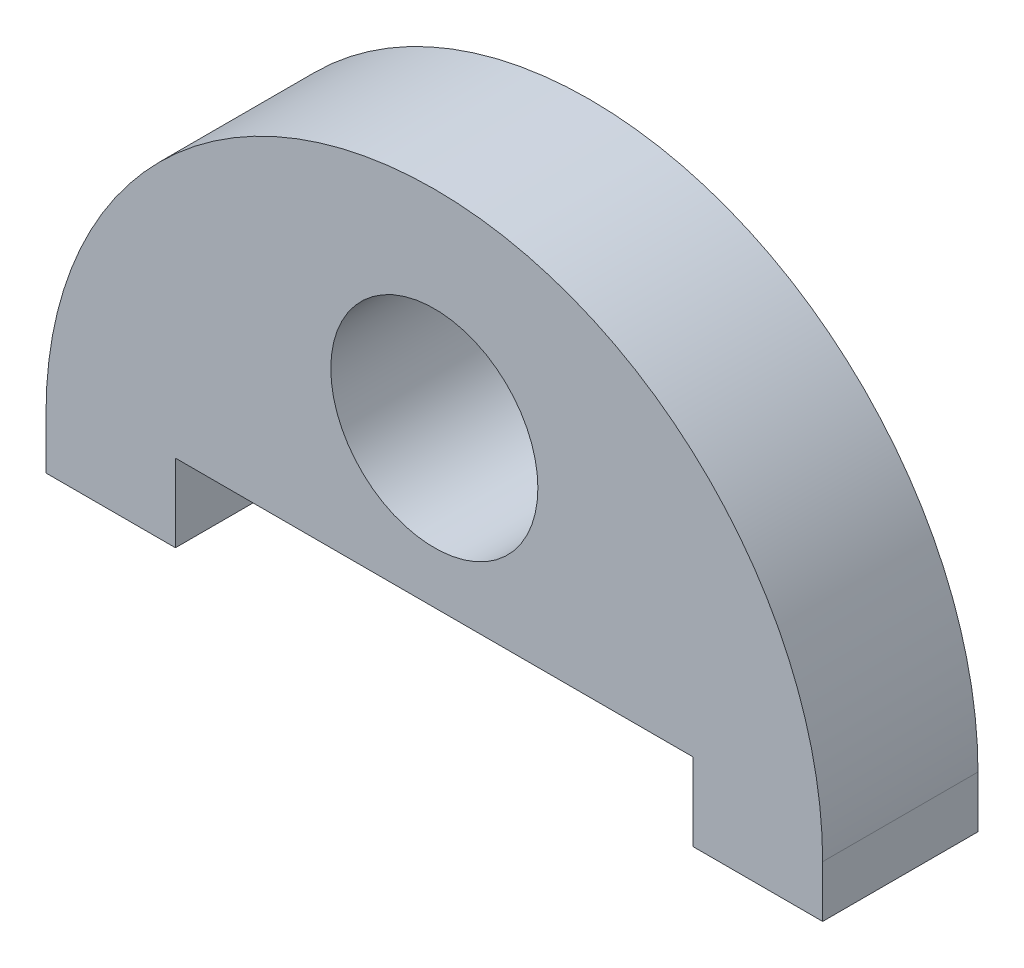
ISO-10303-21;
HEADER;
FILE_DESCRIPTION(('STEP AP214'),'2;1');
FILE_NAME('part.step','',(''),(''),'','','');
FILE_SCHEMA(('AUTOMOTIVE_DESIGN { 1 0 10303 214 1 1 1 1 }'));
ENDSEC;
DATA;
#1=APPLICATION_CONTEXT('core data for automotive mechanical design processes');
#2=APPLICATION_PROTOCOL_DEFINITION('international standard','automotive_design',2000,#1);
#3=PRODUCT_CONTEXT('',#1,'mechanical');
#4=PRODUCT('Part','Part','',(#3));
#5=PRODUCT_RELATED_PRODUCT_CATEGORY('part','',(#4));
#6=PRODUCT_DEFINITION_FORMATION('','',#4);
#7=PRODUCT_DEFINITION_CONTEXT('part definition',#1,'design');
#8=PRODUCT_DEFINITION('design','',#6,#7);
#9=PRODUCT_DEFINITION_SHAPE('','',#8);
#10=(LENGTH_UNIT() NAMED_UNIT(*) SI_UNIT(.MILLI.,.METRE.));
#11=(NAMED_UNIT(*) PLANE_ANGLE_UNIT() SI_UNIT($,.RADIAN.));
#12=(NAMED_UNIT(*) SI_UNIT($,.STERADIAN.) SOLID_ANGLE_UNIT());
#13=UNCERTAINTY_MEASURE_WITH_UNIT(LENGTH_MEASURE(1.E-05),#10,'distance_accuracy_value','');
#14=(GEOMETRIC_REPRESENTATION_CONTEXT(3) GLOBAL_UNCERTAINTY_ASSIGNED_CONTEXT((#13)) GLOBAL_UNIT_ASSIGNED_CONTEXT((#10,
#11,#12)) REPRESENTATION_CONTEXT('',''));
#15=CARTESIAN_POINT('',(0.,0.,0.));
#16=DIRECTION('',(0.,0.,1.));
#17=DIRECTION('',(1.,0.,0.));
#18=AXIS2_PLACEMENT_3D('',#15,#16,#17);
#19=CARTESIAN_POINT('',(15.,2.,6.));
#20=DIRECTION('',(0.,0.,-1.));
#21=DIRECTION('',(-1.,0.,0.));
#22=AXIS2_PLACEMENT_3D('',#19,#20,#21);
#23=PLANE('',#22);
#24=DIRECTION('',(0.,-1.,0.));
#25=VECTOR('',#24,1.);
#26=CARTESIAN_POINT('',(0.,0.,6.));
#27=LINE('',#26,#25);
#28=CARTESIAN_POINT('',(0.,2.,6.));
#29=VERTEX_POINT('',#28);
#30=CARTESIAN_POINT('',(0.,0.,6.));
#31=VERTEX_POINT('',#30);
#32=EDGE_CURVE('E146',#29,#31,#27,.T.);
#33=ORIENTED_EDGE('',*,*,#32,.T.);
#34=DIRECTION('',(1.,0.,0.));
#35=VECTOR('',#34,1.);
#36=CARTESIAN_POINT('',(0.,0.,6.));
#37=LINE('',#36,#35);
#38=CARTESIAN_POINT('',(5.,0.,6.));
#39=VERTEX_POINT('',#38);
#40=EDGE_CURVE('E94',#31,#39,#37,.T.);
#41=ORIENTED_EDGE('',*,*,#40,.T.);
#42=DIRECTION('',(0.,1.,0.));
#43=VECTOR('',#42,1.);
#44=CARTESIAN_POINT('',(5.,0.,6.));
#45=LINE('',#44,#43);
#46=CARTESIAN_POINT('',(5.,3.,6.));
#47=VERTEX_POINT('',#46);
#48=EDGE_CURVE('E161',#39,#47,#45,.T.);
#49=ORIENTED_EDGE('',*,*,#48,.T.);
#50=DIRECTION('',(1.,0.,0.));
#51=VECTOR('',#50,1.);
#52=CARTESIAN_POINT('',(5.,3.,6.));
#53=LINE('',#52,#51);
#54=CARTESIAN_POINT('',(25.,3.,6.));
#55=VERTEX_POINT('',#54);
#56=EDGE_CURVE('E174',#47,#55,#53,.T.);
#57=ORIENTED_EDGE('',*,*,#56,.T.);
#58=DIRECTION('',(0.,-1.,0.));
#59=VECTOR('',#58,1.);
#60=CARTESIAN_POINT('',(25.,3.,6.));
#61=LINE('',#60,#59);
#62=CARTESIAN_POINT('',(25.,0.,6.));
#63=VERTEX_POINT('',#62);
#64=EDGE_CURVE('E113',#55,#63,#61,.T.);
#65=ORIENTED_EDGE('',*,*,#64,.T.);
#66=DIRECTION('',(1.,0.,0.));
#67=VECTOR('',#66,1.);
#68=CARTESIAN_POINT('',(25.,0.,6.));
#69=LINE('',#68,#67);
#70=CARTESIAN_POINT('',(30.,0.,6.));
#71=VERTEX_POINT('',#70);
#72=EDGE_CURVE('E107',#63,#71,#69,.T.);
#73=ORIENTED_EDGE('',*,*,#72,.T.);
#74=DIRECTION('',(0.,1.,0.));
#75=VECTOR('',#74,1.);
#76=CARTESIAN_POINT('',(30.,0.,6.));
#77=LINE('',#76,#75);
#78=CARTESIAN_POINT('',(30.,2.,6.));
#79=VERTEX_POINT('',#78);
#80=EDGE_CURVE('E111',#71,#79,#77,.T.);
#81=ORIENTED_EDGE('',*,*,#80,.T.);
#82=CARTESIAN_POINT('',(15.,2.,6.));
#83=DIRECTION('',(0.,0.,1.));
#84=DIRECTION('',(-1.,0.,0.));
#85=AXIS2_PLACEMENT_3D('',#82,#83,#84);
#86=CIRCLE('',#85,15.);
#87=EDGE_CURVE('E51',#79,#29,#86,.T.);
#88=ORIENTED_EDGE('',*,*,#87,.T.);
#89=EDGE_LOOP('',(#33,#41,#49,#57,#65,#73,#81,#88));
#90=FACE_BOUND('',#89,.T.);
#91=CARTESIAN_POINT('',(15.,9.,6.));
#92=DIRECTION('',(0.,0.,1.));
#93=DIRECTION('',(1.,0.,0.));
#94=AXIS2_PLACEMENT_3D('',#91,#92,#93);
#95=CIRCLE('',#94,4.);
#96=CARTESIAN_POINT('',(19.,9.,6.));
#97=VERTEX_POINT('',#96);
#98=EDGE_CURVE('E135',#97,#97,#95,.T.);
#99=ORIENTED_EDGE('',*,*,#98,.F.);
#100=EDGE_LOOP('',(#99));
#101=FACE_BOUND('',#100,.T.);
#102=ADVANCED_FACE('F34',(#90,#101),#23,.F.);
#103=CARTESIAN_POINT('',(15.,2.,0.));
#104=DIRECTION('',(0.,0.,-1.));
#105=DIRECTION('',(-1.,0.,0.));
#106=AXIS2_PLACEMENT_3D('',#103,#104,#105);
#107=PLANE('',#106);
#108=DIRECTION('',(0.,-1.,0.));
#109=VECTOR('',#108,1.);
#110=CARTESIAN_POINT('',(0.,0.,0.));
#111=LINE('',#110,#109);
#112=CARTESIAN_POINT('',(0.,2.,0.));
#113=VERTEX_POINT('',#112);
#114=CARTESIAN_POINT('',(0.,0.,0.));
#115=VERTEX_POINT('',#114);
#116=EDGE_CURVE('E131',#113,#115,#111,.T.);
#117=ORIENTED_EDGE('',*,*,#116,.F.);
#118=CARTESIAN_POINT('',(15.,2.,0.));
#119=DIRECTION('',(0.,0.,1.));
#120=DIRECTION('',(-1.,0.,0.));
#121=AXIS2_PLACEMENT_3D('',#118,#119,#120);
#122=CIRCLE('',#121,15.);
#123=CARTESIAN_POINT('',(30.,2.,0.));
#124=VERTEX_POINT('',#123);
#125=EDGE_CURVE('E86',#124,#113,#122,.T.);
#126=ORIENTED_EDGE('',*,*,#125,.F.);
#127=DIRECTION('',(0.,1.,0.));
#128=VECTOR('',#127,1.);
#129=CARTESIAN_POINT('',(30.,0.,0.));
#130=LINE('',#129,#128);
#131=CARTESIAN_POINT('',(30.,0.,0.));
#132=VERTEX_POINT('',#131);
#133=EDGE_CURVE('E80',#132,#124,#130,.T.);
#134=ORIENTED_EDGE('',*,*,#133,.F.);
#135=DIRECTION('',(1.,0.,0.));
#136=VECTOR('',#135,1.);
#137=CARTESIAN_POINT('',(25.,0.,0.));
#138=LINE('',#137,#136);
#139=CARTESIAN_POINT('',(25.,0.,0.));
#140=VERTEX_POINT('',#139);
#141=EDGE_CURVE('E121',#140,#132,#138,.T.);
#142=ORIENTED_EDGE('',*,*,#141,.F.);
#143=DIRECTION('',(0.,-1.,0.));
#144=VECTOR('',#143,1.);
#145=CARTESIAN_POINT('',(25.,3.,0.));
#146=LINE('',#145,#144);
#147=CARTESIAN_POINT('',(25.,3.,0.));
#148=VERTEX_POINT('',#147);
#149=EDGE_CURVE('E141',#148,#140,#146,.T.);
#150=ORIENTED_EDGE('',*,*,#149,.F.);
#151=DIRECTION('',(1.,0.,0.));
#152=VECTOR('',#151,1.);
#153=CARTESIAN_POINT('',(5.,3.,0.));
#154=LINE('',#153,#152);
#155=CARTESIAN_POINT('',(5.,3.,0.));
#156=VERTEX_POINT('',#155);
#157=EDGE_CURVE('E139',#156,#148,#154,.T.);
#158=ORIENTED_EDGE('',*,*,#157,.F.);
#159=DIRECTION('',(0.,1.,0.));
#160=VECTOR('',#159,1.);
#161=CARTESIAN_POINT('',(5.,0.,0.));
#162=LINE('',#161,#160);
#163=CARTESIAN_POINT('',(5.,0.,0.));
#164=VERTEX_POINT('',#163);
#165=EDGE_CURVE('E137',#164,#156,#162,.T.);
#166=ORIENTED_EDGE('',*,*,#165,.F.);
#167=DIRECTION('',(1.,0.,0.));
#168=VECTOR('',#167,1.);
#169=CARTESIAN_POINT('',(0.,0.,0.));
#170=LINE('',#169,#168);
#171=EDGE_CURVE('E134',#115,#164,#170,.T.);
#172=ORIENTED_EDGE('',*,*,#171,.F.);
#173=EDGE_LOOP('',(#117,#126,#134,#142,#150,#158,#166,#172));
#174=FACE_BOUND('',#173,.T.);
#175=CARTESIAN_POINT('',(15.,9.,0.));
#176=DIRECTION('',(0.,0.,1.));
#177=DIRECTION('',(1.,0.,0.));
#178=AXIS2_PLACEMENT_3D('',#175,#176,#177);
#179=CIRCLE('',#178,4.);
#180=CARTESIAN_POINT('',(19.,9.,0.));
#181=VERTEX_POINT('',#180);
#182=EDGE_CURVE('E180',#181,#181,#179,.T.);
#183=ORIENTED_EDGE('',*,*,#182,.T.);
#184=EDGE_LOOP('',(#183));
#185=FACE_BOUND('',#184,.T.);
#186=ADVANCED_FACE('F165',(#174,#185),#107,.T.);
#187=CARTESIAN_POINT('',(0.,0.,6.));
#188=DIRECTION('',(1.,0.,0.));
#189=DIRECTION('',(0.,0.,-1.));
#190=AXIS2_PLACEMENT_3D('',#187,#188,#189);
#191=PLANE('',#190);
#192=ORIENTED_EDGE('',*,*,#116,.T.);
#193=DIRECTION('',(0.,0.,-1.));
#194=VECTOR('',#193,1.);
#195=CARTESIAN_POINT('',(0.,0.,6.));
#196=LINE('',#195,#194);
#197=EDGE_CURVE('E11',#31,#115,#196,.T.);
#198=ORIENTED_EDGE('',*,*,#197,.F.);
#199=ORIENTED_EDGE('',*,*,#32,.F.);
#200=DIRECTION('',(0.,0.,-1.));
#201=VECTOR('',#200,1.);
#202=CARTESIAN_POINT('',(0.,2.,6.));
#203=LINE('',#202,#201);
#204=EDGE_CURVE('E127',#29,#113,#203,.T.);
#205=ORIENTED_EDGE('',*,*,#204,.T.);
#206=EDGE_LOOP('',(#192,#198,#199,#205));
#207=FACE_BOUND('',#206,.T.);
#208=ADVANCED_FACE('F36',(#207),#191,.F.);
#209=CARTESIAN_POINT('',(0.,0.,6.));
#210=DIRECTION('',(0.,1.,0.));
#211=DIRECTION('',(0.,0.,1.));
#212=AXIS2_PLACEMENT_3D('',#209,#210,#211);
#213=PLANE('',#212);
#214=ORIENTED_EDGE('',*,*,#171,.T.);
#215=DIRECTION('',(0.,0.,-1.));
#216=VECTOR('',#215,1.);
#217=CARTESIAN_POINT('',(5.,0.,6.));
#218=LINE('',#217,#216);
#219=EDGE_CURVE('E43',#39,#164,#218,.T.);
#220=ORIENTED_EDGE('',*,*,#219,.F.);
#221=ORIENTED_EDGE('',*,*,#40,.F.);
#222=ORIENTED_EDGE('',*,*,#197,.T.);
#223=EDGE_LOOP('',(#214,#220,#221,#222));
#224=FACE_BOUND('',#223,.T.);
#225=ADVANCED_FACE('F208',(#224),#213,.F.);
#226=CARTESIAN_POINT('',(5.,0.,6.));
#227=DIRECTION('',(-1.,0.,0.));
#228=DIRECTION('',(0.,0.,1.));
#229=AXIS2_PLACEMENT_3D('',#226,#227,#228);
#230=PLANE('',#229);
#231=ORIENTED_EDGE('',*,*,#165,.T.);
#232=DIRECTION('',(0.,0.,-1.));
#233=VECTOR('',#232,1.);
#234=CARTESIAN_POINT('',(5.,3.,6.));
#235=LINE('',#234,#233);
#236=EDGE_CURVE('E153',#47,#156,#235,.T.);
#237=ORIENTED_EDGE('',*,*,#236,.F.);
#238=ORIENTED_EDGE('',*,*,#48,.F.);
#239=ORIENTED_EDGE('',*,*,#219,.T.);
#240=EDGE_LOOP('',(#231,#237,#238,#239));
#241=FACE_BOUND('',#240,.T.);
#242=ADVANCED_FACE('F159',(#241),#230,.F.);
#243=CARTESIAN_POINT('',(5.,3.,6.));
#244=DIRECTION('',(0.,1.,0.));
#245=DIRECTION('',(0.,0.,1.));
#246=AXIS2_PLACEMENT_3D('',#243,#244,#245);
#247=PLANE('',#246);
#248=ORIENTED_EDGE('',*,*,#157,.T.);
#249=DIRECTION('',(0.,0.,-1.));
#250=VECTOR('',#249,1.);
#251=CARTESIAN_POINT('',(25.,3.,6.));
#252=LINE('',#251,#250);
#253=EDGE_CURVE('E150',#55,#148,#252,.T.);
#254=ORIENTED_EDGE('',*,*,#253,.F.);
#255=ORIENTED_EDGE('',*,*,#56,.F.);
#256=ORIENTED_EDGE('',*,*,#236,.T.);
#257=EDGE_LOOP('',(#248,#254,#255,#256));
#258=FACE_BOUND('',#257,.T.);
#259=ADVANCED_FACE('F170',(#258),#247,.F.);
#260=CARTESIAN_POINT('',(25.,3.,6.));
#261=DIRECTION('',(1.,0.,0.));
#262=DIRECTION('',(0.,0.,-1.));
#263=AXIS2_PLACEMENT_3D('',#260,#261,#262);
#264=PLANE('',#263);
#265=ORIENTED_EDGE('',*,*,#149,.T.);
#266=DIRECTION('',(0.,0.,-1.));
#267=VECTOR('',#266,1.);
#268=CARTESIAN_POINT('',(25.,0.,6.));
#269=LINE('',#268,#267);
#270=EDGE_CURVE('E122',#63,#140,#269,.T.);
#271=ORIENTED_EDGE('',*,*,#270,.F.);
#272=ORIENTED_EDGE('',*,*,#64,.F.);
#273=ORIENTED_EDGE('',*,*,#253,.T.);
#274=EDGE_LOOP('',(#265,#271,#272,#273));
#275=FACE_BOUND('',#274,.T.);
#276=ADVANCED_FACE('F173',(#275),#264,.F.);
#277=CARTESIAN_POINT('',(25.,0.,6.));
#278=DIRECTION('',(0.,1.,0.));
#279=DIRECTION('',(0.,0.,1.));
#280=AXIS2_PLACEMENT_3D('',#277,#278,#279);
#281=PLANE('',#280);
#282=ORIENTED_EDGE('',*,*,#141,.T.);
#283=DIRECTION('',(0.,0.,-1.));
#284=VECTOR('',#283,1.);
#285=CARTESIAN_POINT('',(30.,0.,6.));
#286=LINE('',#285,#284);
#287=EDGE_CURVE('E118',#71,#132,#286,.T.);
#288=ORIENTED_EDGE('',*,*,#287,.F.);
#289=ORIENTED_EDGE('',*,*,#72,.F.);
#290=ORIENTED_EDGE('',*,*,#270,.T.);
#291=EDGE_LOOP('',(#282,#288,#289,#290));
#292=FACE_BOUND('',#291,.T.);
#293=ADVANCED_FACE('F119',(#292),#281,.F.);
#294=CARTESIAN_POINT('',(30.,0.,6.));
#295=DIRECTION('',(-1.,0.,0.));
#296=DIRECTION('',(0.,0.,1.));
#297=AXIS2_PLACEMENT_3D('',#294,#295,#296);
#298=PLANE('',#297);
#299=ORIENTED_EDGE('',*,*,#133,.T.);
#300=DIRECTION('',(0.,0.,-1.));
#301=VECTOR('',#300,1.);
#302=CARTESIAN_POINT('',(30.,2.,6.));
#303=LINE('',#302,#301);
#304=EDGE_CURVE('E123',#79,#124,#303,.T.);
#305=ORIENTED_EDGE('',*,*,#304,.F.);
#306=ORIENTED_EDGE('',*,*,#80,.F.);
#307=ORIENTED_EDGE('',*,*,#287,.T.);
#308=EDGE_LOOP('',(#299,#305,#306,#307));
#309=FACE_BOUND('',#308,.T.);
#310=ADVANCED_FACE('F125',(#309),#298,.F.);
#311=CARTESIAN_POINT('',(15.,2.,6.));
#312=DIRECTION('',(0.,0.,-1.));
#313=DIRECTION('',(-1.,0.,0.));
#314=AXIS2_PLACEMENT_3D('',#311,#312,#313);
#315=CYLINDRICAL_SURFACE('',#314,15.);
#316=ORIENTED_EDGE('',*,*,#125,.T.);
#317=ORIENTED_EDGE('',*,*,#204,.F.);
#318=ORIENTED_EDGE('',*,*,#87,.F.);
#319=ORIENTED_EDGE('',*,*,#304,.T.);
#320=EDGE_LOOP('',(#316,#317,#318,#319));
#321=FACE_BOUND('',#320,.T.);
#322=ADVANCED_FACE('F196',(#321),#315,.T.);
#323=CARTESIAN_POINT('',(15.,9.,6.));
#324=DIRECTION('',(0.,0.,-1.));
#325=DIRECTION('',(-1.,0.,0.));
#326=AXIS2_PLACEMENT_3D('',#323,#324,#325);
#327=CYLINDRICAL_SURFACE('',#326,4.);
#328=ORIENTED_EDGE('',*,*,#98,.T.);
#329=EDGE_LOOP('',(#328));
#330=FACE_BOUND('',#329,.T.);
#331=ORIENTED_EDGE('',*,*,#182,.F.);
#332=EDGE_LOOP('',(#331));
#333=FACE_BOUND('',#332,.T.);
#334=ADVANCED_FACE('F186',(#330,#333),#327,.F.);
#335=CLOSED_SHELL('',(#102,#186,#208,#225,#242,#259,#276,#293,#310,#322,#334));
#336=MANIFOLD_SOLID_BREP('B2',#335);
#337=ADVANCED_BREP_SHAPE_REPRESENTATION('',(#18,#336),#14);
#338=SHAPE_DEFINITION_REPRESENTATION(#9,#337);
ENDSEC;
END-ISO-10303-21;
